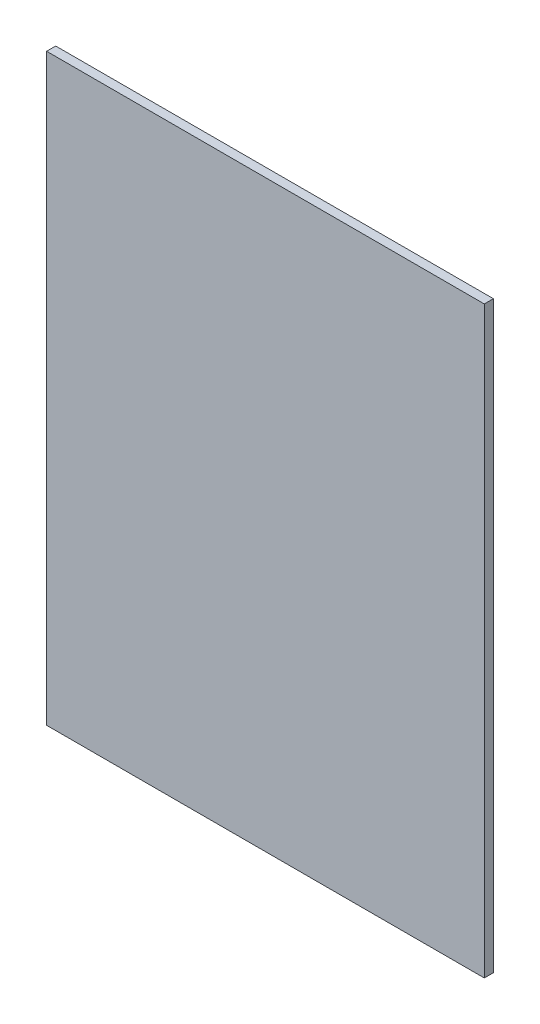
ISO-10303-21;
HEADER;
FILE_DESCRIPTION(('STEP AP214'),'2;1');
FILE_NAME('part.step','',(''),(''),'','','');
FILE_SCHEMA(('AUTOMOTIVE_DESIGN { 1 0 10303 214 1 1 1 1 }'));
ENDSEC;
DATA;
#1=APPLICATION_CONTEXT('core data for automotive mechanical design processes');
#2=APPLICATION_PROTOCOL_DEFINITION('international standard','automotive_design',2000,#1);
#3=PRODUCT_CONTEXT('',#1,'mechanical');
#4=PRODUCT('Part','Part','',(#3));
#5=PRODUCT_RELATED_PRODUCT_CATEGORY('part','',(#4));
#6=PRODUCT_DEFINITION_FORMATION('','',#4);
#7=PRODUCT_DEFINITION_CONTEXT('part definition',#1,'design');
#8=PRODUCT_DEFINITION('design','',#6,#7);
#9=PRODUCT_DEFINITION_SHAPE('','',#8);
#10=(LENGTH_UNIT() NAMED_UNIT(*) SI_UNIT(.MILLI.,.METRE.));
#11=(NAMED_UNIT(*) PLANE_ANGLE_UNIT() SI_UNIT($,.RADIAN.));
#12=(NAMED_UNIT(*) SI_UNIT($,.STERADIAN.) SOLID_ANGLE_UNIT());
#13=UNCERTAINTY_MEASURE_WITH_UNIT(LENGTH_MEASURE(1.E-05),#10,'distance_accuracy_value','');
#14=(GEOMETRIC_REPRESENTATION_CONTEXT(3) GLOBAL_UNCERTAINTY_ASSIGNED_CONTEXT((#13)) GLOBAL_UNIT_ASSIGNED_CONTEXT((#10,
#11,#12)) REPRESENTATION_CONTEXT('',''));
#15=CARTESIAN_POINT('',(0.,0.,0.));
#16=DIRECTION('',(0.,0.,1.));
#17=DIRECTION('',(1.,0.,0.));
#18=AXIS2_PLACEMENT_3D('',#15,#16,#17);
#19=CARTESIAN_POINT('',(0.,0.,0.));
#20=DIRECTION('',(0.,0.,-1.));
#21=DIRECTION('',(-1.,0.,0.));
#22=AXIS2_PLACEMENT_3D('',#19,#20,#21);
#23=PLANE('',#22);
#24=DIRECTION('',(0.,1.,0.));
#25=VECTOR('',#24,1.);
#26=CARTESIAN_POINT('',(68.5595006517325,-64.0728553359398,0.));
#27=LINE('',#26,#25);
#28=CARTESIAN_POINT('',(68.5595006517325,38.6271446640602,0.));
#29=VERTEX_POINT('',#28);
#30=CARTESIAN_POINT('',(68.5595006517325,-64.0728553359398,0.));
#31=VERTEX_POINT('',#30);
#32=EDGE_CURVE('E55',#29,#31,#27,.F.);
#33=ORIENTED_EDGE('',*,*,#32,.T.);
#34=DIRECTION('',(1.,0.,0.));
#35=VECTOR('',#34,1.);
#36=CARTESIAN_POINT('',(-8.44049934826748,-64.0728553359398,0.));
#37=LINE('',#36,#35);
#38=CARTESIAN_POINT('',(-8.44049934826748,-64.0728553359398,0.));
#39=VERTEX_POINT('',#38);
#40=EDGE_CURVE('E76',#31,#39,#37,.F.);
#41=ORIENTED_EDGE('',*,*,#40,.T.);
#42=DIRECTION('',(0.,1.,0.));
#43=VECTOR('',#42,1.);
#44=CARTESIAN_POINT('',(-8.44049934826748,-64.0728553359398,0.));
#45=LINE('',#44,#43);
#46=CARTESIAN_POINT('',(-8.44049934826748,38.6271446640602,0.));
#47=VERTEX_POINT('',#46);
#48=EDGE_CURVE('E58',#39,#47,#45,.T.);
#49=ORIENTED_EDGE('',*,*,#48,.T.);
#50=DIRECTION('',(1.,0.,0.));
#51=VECTOR('',#50,1.);
#52=CARTESIAN_POINT('',(-8.44049934826748,38.6271446640602,0.));
#53=LINE('',#52,#51);
#54=EDGE_CURVE('E20',#47,#29,#53,.T.);
#55=ORIENTED_EDGE('',*,*,#54,.T.);
#56=EDGE_LOOP('',(#33,#41,#49,#55));
#57=FACE_BOUND('',#56,.T.);
#58=ADVANCED_FACE('F17',(#57),#23,.T.);
#59=CARTESIAN_POINT('',(-8.44049934826748,38.6271446640602,1.6));
#60=DIRECTION('',(0.,-1.,0.));
#61=DIRECTION('',(0.,0.,-1.));
#62=AXIS2_PLACEMENT_3D('',#59,#60,#61);
#63=PLANE('',#62);
#64=DIRECTION('',(0.,0.,-1.));
#65=VECTOR('',#64,1.);
#66=CARTESIAN_POINT('',(-8.44049934826748,38.6271446640602,1.6));
#67=LINE('',#66,#65);
#68=CARTESIAN_POINT('',(-8.44049934826748,38.6271446640602,1.6));
#69=VERTEX_POINT('',#68);
#70=EDGE_CURVE('E78',#47,#69,#67,.F.);
#71=ORIENTED_EDGE('',*,*,#70,.T.);
#72=DIRECTION('',(-1.,0.,0.));
#73=VECTOR('',#72,1.);
#74=CARTESIAN_POINT('',(0.,38.6271446640602,1.6));
#75=LINE('',#74,#73);
#76=CARTESIAN_POINT('',(68.5595006517325,38.6271446640602,1.6));
#77=VERTEX_POINT('',#76);
#78=EDGE_CURVE('E73',#69,#77,#75,.F.);
#79=ORIENTED_EDGE('',*,*,#78,.T.);
#80=DIRECTION('',(0.,0.,1.));
#81=VECTOR('',#80,1.);
#82=CARTESIAN_POINT('',(68.5595006517325,38.6271446640602,1.6));
#83=LINE('',#82,#81);
#84=EDGE_CURVE('E63',#77,#29,#83,.F.);
#85=ORIENTED_EDGE('',*,*,#84,.T.);
#86=ORIENTED_EDGE('',*,*,#54,.F.);
#87=EDGE_LOOP('',(#71,#79,#85,#86));
#88=FACE_BOUND('',#87,.T.);
#89=ADVANCED_FACE('F72',(#88),#63,.F.);
#90=CARTESIAN_POINT('',(68.5595006517325,-64.0728553359398,1.6));
#91=DIRECTION('',(-1.,0.,0.));
#92=DIRECTION('',(0.,0.,1.));
#93=AXIS2_PLACEMENT_3D('',#90,#91,#92);
#94=PLANE('',#93);
#95=ORIENTED_EDGE('',*,*,#84,.F.);
#96=DIRECTION('',(0.,1.,0.));
#97=VECTOR('',#96,1.);
#98=CARTESIAN_POINT('',(68.5595006517325,0.,1.6));
#99=LINE('',#98,#97);
#100=CARTESIAN_POINT('',(68.5595006517325,-64.0728553359398,1.6));
#101=VERTEX_POINT('',#100);
#102=EDGE_CURVE('E83',#77,#101,#99,.F.);
#103=ORIENTED_EDGE('',*,*,#102,.T.);
#104=DIRECTION('',(0.,0.,1.));
#105=VECTOR('',#104,1.);
#106=CARTESIAN_POINT('',(68.5595006517325,-64.0728553359398,1.6));
#107=LINE('',#106,#105);
#108=EDGE_CURVE('E69',#101,#31,#107,.F.);
#109=ORIENTED_EDGE('',*,*,#108,.T.);
#110=ORIENTED_EDGE('',*,*,#32,.F.);
#111=EDGE_LOOP('',(#95,#103,#109,#110));
#112=FACE_BOUND('',#111,.T.);
#113=ADVANCED_FACE('F66',(#112),#94,.F.);
#114=CARTESIAN_POINT('',(-8.44049934826748,-64.0728553359398,1.6));
#115=DIRECTION('',(0.,1.,0.));
#116=DIRECTION('',(0.,0.,1.));
#117=AXIS2_PLACEMENT_3D('',#114,#115,#116);
#118=PLANE('',#117);
#119=ORIENTED_EDGE('',*,*,#108,.F.);
#120=DIRECTION('',(-1.,0.,0.));
#121=VECTOR('',#120,1.);
#122=CARTESIAN_POINT('',(0.,-64.0728553359398,1.6));
#123=LINE('',#122,#121);
#124=CARTESIAN_POINT('',(-8.44049934826748,-64.0728553359398,1.6));
#125=VERTEX_POINT('',#124);
#126=EDGE_CURVE('E26',#101,#125,#123,.T.);
#127=ORIENTED_EDGE('',*,*,#126,.T.);
#128=DIRECTION('',(0.,0.,-1.));
#129=VECTOR('',#128,1.);
#130=CARTESIAN_POINT('',(-8.44049934826748,-64.0728553359398,1.6));
#131=LINE('',#130,#129);
#132=EDGE_CURVE('E34',#125,#39,#131,.T.);
#133=ORIENTED_EDGE('',*,*,#132,.T.);
#134=ORIENTED_EDGE('',*,*,#40,.F.);
#135=EDGE_LOOP('',(#119,#127,#133,#134));
#136=FACE_BOUND('',#135,.T.);
#137=ADVANCED_FACE('F88',(#136),#118,.F.);
#138=CARTESIAN_POINT('',(-8.44049934826748,-64.0728553359398,1.6));
#139=DIRECTION('',(1.,0.,0.));
#140=DIRECTION('',(0.,0.,-1.));
#141=AXIS2_PLACEMENT_3D('',#138,#139,#140);
#142=PLANE('',#141);
#143=ORIENTED_EDGE('',*,*,#132,.F.);
#144=DIRECTION('',(0.,1.,0.));
#145=VECTOR('',#144,1.);
#146=CARTESIAN_POINT('',(-8.44049934826748,0.,1.6));
#147=LINE('',#146,#145);
#148=EDGE_CURVE('E11',#125,#69,#147,.T.);
#149=ORIENTED_EDGE('',*,*,#148,.T.);
#150=ORIENTED_EDGE('',*,*,#70,.F.);
#151=ORIENTED_EDGE('',*,*,#48,.F.);
#152=EDGE_LOOP('',(#143,#149,#150,#151));
#153=FACE_BOUND('',#152,.T.);
#154=ADVANCED_FACE('F91',(#153),#142,.F.);
#155=CARTESIAN_POINT('',(0.,0.,1.6));
#156=DIRECTION('',(0.,0.,-1.));
#157=DIRECTION('',(-1.,0.,0.));
#158=AXIS2_PLACEMENT_3D('',#155,#156,#157);
#159=PLANE('',#158);
#160=ORIENTED_EDGE('',*,*,#126,.F.);
#161=ORIENTED_EDGE('',*,*,#102,.F.);
#162=ORIENTED_EDGE('',*,*,#78,.F.);
#163=ORIENTED_EDGE('',*,*,#148,.F.);
#164=EDGE_LOOP('',(#160,#161,#162,#163));
#165=FACE_BOUND('',#164,.T.);
#166=ADVANCED_FACE('F90',(#165),#159,.F.);
#167=CLOSED_SHELL('',(#58,#89,#113,#137,#154,#166));
#168=MANIFOLD_SOLID_BREP('B1',#167);
#169=ADVANCED_BREP_SHAPE_REPRESENTATION('',(#18,#168),#14);
#170=SHAPE_DEFINITION_REPRESENTATION(#9,#169);
ENDSEC;
END-ISO-10303-21;
